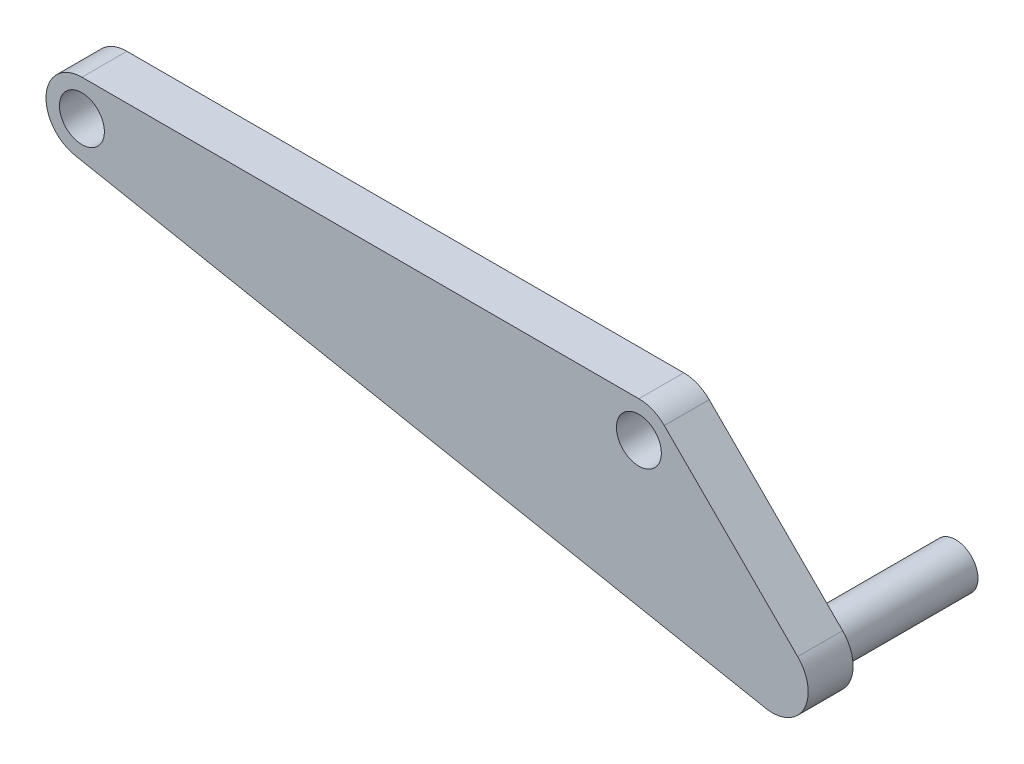
ISO-10303-21;
HEADER;
FILE_DESCRIPTION(('STEP AP214'),'2;1');
FILE_NAME('part.step','',(''),(''),'','','');
FILE_SCHEMA(('AUTOMOTIVE_DESIGN { 1 0 10303 214 1 1 1 1 }'));
ENDSEC;
DATA;
#1=APPLICATION_CONTEXT('core data for automotive mechanical design processes');
#2=APPLICATION_PROTOCOL_DEFINITION('international standard','automotive_design',2000,#1);
#3=PRODUCT_CONTEXT('',#1,'mechanical');
#4=PRODUCT('Part','Part','',(#3));
#5=PRODUCT_RELATED_PRODUCT_CATEGORY('part','',(#4));
#6=PRODUCT_DEFINITION_FORMATION('','',#4);
#7=PRODUCT_DEFINITION_CONTEXT('part definition',#1,'design');
#8=PRODUCT_DEFINITION('design','',#6,#7);
#9=PRODUCT_DEFINITION_SHAPE('','',#8);
#10=(LENGTH_UNIT() NAMED_UNIT(*) SI_UNIT(.MILLI.,.METRE.));
#11=(NAMED_UNIT(*) PLANE_ANGLE_UNIT() SI_UNIT($,.RADIAN.));
#12=(NAMED_UNIT(*) SI_UNIT($,.STERADIAN.) SOLID_ANGLE_UNIT());
#13=UNCERTAINTY_MEASURE_WITH_UNIT(LENGTH_MEASURE(1.E-05),#10,'distance_accuracy_value','');
#14=(GEOMETRIC_REPRESENTATION_CONTEXT(3) GLOBAL_UNCERTAINTY_ASSIGNED_CONTEXT((#13)) GLOBAL_UNIT_ASSIGNED_CONTEXT((#10,
#11,#12)) REPRESENTATION_CONTEXT('',''));
#15=CARTESIAN_POINT('',(0.,0.,0.));
#16=DIRECTION('',(0.,0.,1.));
#17=DIRECTION('',(1.,0.,0.));
#18=AXIS2_PLACEMENT_3D('',#15,#16,#17);
#19=CARTESIAN_POINT('',(-62.,0.,5.));
#20=DIRECTION('',(0.,0.,1.));
#21=DIRECTION('',(1.,0.,0.));
#22=AXIS2_PLACEMENT_3D('',#19,#20,#21);
#23=PLANE('',#22);
#24=CARTESIAN_POINT('',(-62.,0.,5.));
#25=DIRECTION('',(0.,0.,1.));
#26=DIRECTION('',(1.,0.,0.));
#27=AXIS2_PLACEMENT_3D('',#24,#25,#26);
#28=CIRCLE('',#27,2.5);
#29=CARTESIAN_POINT('',(-59.5,0.,5.));
#30=VERTEX_POINT('',#29);
#31=EDGE_CURVE('E124',#30,#30,#28,.T.);
#32=ORIENTED_EDGE('',*,*,#31,.F.);
#33=EDGE_LOOP('',(#32));
#34=FACE_BOUND('',#33,.T.);
#35=CARTESIAN_POINT('',(-62.,0.,5.));
#36=DIRECTION('',(0.,0.,1.));
#37=DIRECTION('',(1.,0.,0.));
#38=AXIS2_PLACEMENT_3D('',#35,#36,#37);
#39=CIRCLE('',#38,4.);
#40=CARTESIAN_POINT('',(-62.,3.99999999999999,5.));
#41=VERTEX_POINT('',#40);
#42=CARTESIAN_POINT('',(-62.7588657347675,-3.92735570028943,5.));
#43=VERTEX_POINT('',#42);
#44=EDGE_CURVE('E131',#41,#43,#39,.T.);
#45=ORIENTED_EDGE('',*,*,#44,.T.);
#46=DIRECTION('',(0.981838925072355,-0.189716433691869,0.));
#47=VECTOR('',#46,1.);
#48=CARTESIAN_POINT('',(14.0903766701501,-18.7765981052068,5.));
#49=LINE('',#48,#47);
#50=CARTESIAN_POINT('',(14.0903766701501,-18.7765981052068,5.));
#51=VERTEX_POINT('',#50);
#52=EDGE_CURVE('E89',#43,#51,#49,.T.);
#53=ORIENTED_EDGE('',*,*,#52,.T.);
#54=CARTESIAN_POINT('',(14.8492424049176,-14.8492424049174,5.));
#55=DIRECTION('',(0.,0.,1.));
#56=DIRECTION('',(1.,0.,0.));
#57=AXIS2_PLACEMENT_3D('',#54,#55,#56);
#58=CIRCLE('',#57,4.);
#59=CARTESIAN_POINT('',(17.6776695296638,-12.0208152801712,5.));
#60=VERTEX_POINT('',#59);
#61=EDGE_CURVE('E102',#51,#60,#58,.T.);
#62=ORIENTED_EDGE('',*,*,#61,.T.);
#63=DIRECTION('',(-0.707106781186551,0.707106781186544,0.));
#64=VECTOR('',#63,1.);
#65=CARTESIAN_POINT('',(2.82842712474617,2.82842712474621,5.));
#66=LINE('',#65,#64);
#67=CARTESIAN_POINT('',(2.82842712474617,2.82842712474621,5.));
#68=VERTEX_POINT('',#67);
#69=EDGE_CURVE('E96',#60,#68,#66,.T.);
#70=ORIENTED_EDGE('',*,*,#69,.T.);
#71=CARTESIAN_POINT('',(0.,0.,5.));
#72=DIRECTION('',(0.,0.,1.));
#73=DIRECTION('',(1.,0.,0.));
#74=AXIS2_PLACEMENT_3D('',#71,#72,#73);
#75=CIRCLE('',#74,4.);
#76=CARTESIAN_POINT('',(0.,4.,5.));
#77=VERTEX_POINT('',#76);
#78=EDGE_CURVE('E100',#68,#77,#75,.T.);
#79=ORIENTED_EDGE('',*,*,#78,.T.);
#80=DIRECTION('',(-1.,0.,0.));
#81=VECTOR('',#80,1.);
#82=CARTESIAN_POINT('',(-62.,3.99999999999999,5.));
#83=LINE('',#82,#81);
#84=EDGE_CURVE('E51',#77,#41,#83,.T.);
#85=ORIENTED_EDGE('',*,*,#84,.T.);
#86=EDGE_LOOP('',(#45,#53,#62,#70,#79,#85));
#87=FACE_BOUND('',#86,.T.);
#88=CARTESIAN_POINT('',(0.,0.,5.));
#89=DIRECTION('',(0.,0.,1.));
#90=DIRECTION('',(1.,0.,0.));
#91=AXIS2_PLACEMENT_3D('',#88,#89,#90);
#92=CIRCLE('',#91,2.5);
#93=CARTESIAN_POINT('',(2.5,0.,5.));
#94=VERTEX_POINT('',#93);
#95=EDGE_CURVE('E154',#94,#94,#92,.T.);
#96=ORIENTED_EDGE('',*,*,#95,.F.);
#97=EDGE_LOOP('',(#96));
#98=FACE_BOUND('',#97,.T.);
#99=ADVANCED_FACE('F34',(#34,#87,#98),#23,.T.);
#100=CARTESIAN_POINT('',(-62.,0.,0.));
#101=DIRECTION('',(0.,0.,1.));
#102=DIRECTION('',(1.,0.,0.));
#103=AXIS2_PLACEMENT_3D('',#100,#101,#102);
#104=PLANE('',#103);
#105=CARTESIAN_POINT('',(14.8492424049176,-14.8492424049174,0.));
#106=DIRECTION('',(0.,0.,1.));
#107=DIRECTION('',(1.,0.,0.));
#108=AXIS2_PLACEMENT_3D('',#105,#106,#107);
#109=CIRCLE('',#108,2.5);
#110=CARTESIAN_POINT('',(17.3492424049176,-14.8492424049174,0.));
#111=VERTEX_POINT('',#110);
#112=EDGE_CURVE('E11',#111,#111,#109,.F.);
#113=ORIENTED_EDGE('',*,*,#112,.F.);
#114=EDGE_LOOP('',(#113));
#115=FACE_BOUND('',#114,.T.);
#116=CARTESIAN_POINT('',(-62.,0.,0.));
#117=DIRECTION('',(0.,0.,1.));
#118=DIRECTION('',(1.,0.,0.));
#119=AXIS2_PLACEMENT_3D('',#116,#117,#118);
#120=CIRCLE('',#119,4.);
#121=CARTESIAN_POINT('',(-62.,3.99999999999999,0.));
#122=VERTEX_POINT('',#121);
#123=CARTESIAN_POINT('',(-62.7588657347675,-3.92735570028943,0.));
#124=VERTEX_POINT('',#123);
#125=EDGE_CURVE('E120',#122,#124,#120,.T.);
#126=ORIENTED_EDGE('',*,*,#125,.F.);
#127=DIRECTION('',(-1.,0.,0.));
#128=VECTOR('',#127,1.);
#129=CARTESIAN_POINT('',(-62.,3.99999999999999,0.));
#130=LINE('',#129,#128);
#131=CARTESIAN_POINT('',(0.,4.,0.));
#132=VERTEX_POINT('',#131);
#133=EDGE_CURVE('E80',#132,#122,#130,.T.);
#134=ORIENTED_EDGE('',*,*,#133,.F.);
#135=CARTESIAN_POINT('',(0.,0.,0.));
#136=DIRECTION('',(0.,0.,1.));
#137=DIRECTION('',(1.,0.,0.));
#138=AXIS2_PLACEMENT_3D('',#135,#136,#137);
#139=CIRCLE('',#138,4.);
#140=CARTESIAN_POINT('',(2.82842712474617,2.82842712474621,0.));
#141=VERTEX_POINT('',#140);
#142=EDGE_CURVE('E74',#141,#132,#139,.T.);
#143=ORIENTED_EDGE('',*,*,#142,.F.);
#144=DIRECTION('',(-0.707106781186551,0.707106781186544,0.));
#145=VECTOR('',#144,1.);
#146=CARTESIAN_POINT('',(2.82842712474617,2.82842712474621,0.));
#147=LINE('',#146,#145);
#148=CARTESIAN_POINT('',(17.6776695296638,-12.0208152801712,0.));
#149=VERTEX_POINT('',#148);
#150=EDGE_CURVE('E110',#149,#141,#147,.T.);
#151=ORIENTED_EDGE('',*,*,#150,.F.);
#152=CARTESIAN_POINT('',(14.8492424049176,-14.8492424049174,0.));
#153=DIRECTION('',(0.,0.,1.));
#154=DIRECTION('',(1.,0.,0.));
#155=AXIS2_PLACEMENT_3D('',#152,#153,#154);
#156=CIRCLE('',#155,4.);
#157=CARTESIAN_POINT('',(14.0903766701501,-18.7765981052068,0.));
#158=VERTEX_POINT('',#157);
#159=EDGE_CURVE('E126',#158,#149,#156,.T.);
#160=ORIENTED_EDGE('',*,*,#159,.F.);
#161=DIRECTION('',(0.981838925072355,-0.189716433691869,0.));
#162=VECTOR('',#161,1.);
#163=CARTESIAN_POINT('',(14.0903766701501,-18.7765981052068,0.));
#164=LINE('',#163,#162);
#165=EDGE_CURVE('E123',#124,#158,#164,.T.);
#166=ORIENTED_EDGE('',*,*,#165,.F.);
#167=EDGE_LOOP('',(#126,#134,#143,#151,#160,#166));
#168=FACE_BOUND('',#167,.T.);
#169=CARTESIAN_POINT('',(-62.,0.,0.));
#170=DIRECTION('',(0.,0.,1.));
#171=DIRECTION('',(1.,0.,0.));
#172=AXIS2_PLACEMENT_3D('',#169,#170,#171);
#173=CIRCLE('',#172,2.5);
#174=CARTESIAN_POINT('',(-59.5,0.,0.));
#175=VERTEX_POINT('',#174);
#176=EDGE_CURVE('E151',#175,#175,#173,.T.);
#177=ORIENTED_EDGE('',*,*,#176,.T.);
#178=EDGE_LOOP('',(#177));
#179=FACE_BOUND('',#178,.T.);
#180=CARTESIAN_POINT('',(0.,0.,0.));
#181=DIRECTION('',(0.,0.,1.));
#182=DIRECTION('',(1.,0.,0.));
#183=AXIS2_PLACEMENT_3D('',#180,#181,#182);
#184=CIRCLE('',#183,2.5);
#185=CARTESIAN_POINT('',(2.5,0.,0.));
#186=VERTEX_POINT('',#185);
#187=EDGE_CURVE('E157',#186,#186,#184,.T.);
#188=ORIENTED_EDGE('',*,*,#187,.T.);
#189=EDGE_LOOP('',(#188));
#190=FACE_BOUND('',#189,.T.);
#191=ADVANCED_FACE('F143',(#115,#168,#179,#190),#104,.F.);
#192=CARTESIAN_POINT('',(-62.,0.,5.));
#193=DIRECTION('',(0.,0.,-1.));
#194=DIRECTION('',(-1.,0.,0.));
#195=AXIS2_PLACEMENT_3D('',#192,#193,#194);
#196=CYLINDRICAL_SURFACE('',#195,4.);
#197=ORIENTED_EDGE('',*,*,#125,.T.);
#198=DIRECTION('',(0.,0.,-1.));
#199=VECTOR('',#198,1.);
#200=CARTESIAN_POINT('',(-62.7588657347675,-3.92735570028943,5.));
#201=LINE('',#200,#199);
#202=EDGE_CURVE('E43',#43,#124,#201,.T.);
#203=ORIENTED_EDGE('',*,*,#202,.F.);
#204=ORIENTED_EDGE('',*,*,#44,.F.);
#205=DIRECTION('',(0.,0.,-1.));
#206=VECTOR('',#205,1.);
#207=CARTESIAN_POINT('',(-62.,3.99999999999999,5.));
#208=LINE('',#207,#206);
#209=EDGE_CURVE('E116',#41,#122,#208,.T.);
#210=ORIENTED_EDGE('',*,*,#209,.T.);
#211=EDGE_LOOP('',(#197,#203,#204,#210));
#212=FACE_BOUND('',#211,.T.);
#213=ADVANCED_FACE('F36',(#212),#196,.T.);
#214=CARTESIAN_POINT('',(14.0903766701501,-18.7765981052068,5.));
#215=DIRECTION('',(0.189716433691869,0.981838925072355,0.));
#216=DIRECTION('',(-0.981838925072355,0.189716433691869,0.));
#217=AXIS2_PLACEMENT_3D('',#214,#215,#216);
#218=PLANE('',#217);
#219=ORIENTED_EDGE('',*,*,#165,.T.);
#220=DIRECTION('',(0.,0.,-1.));
#221=VECTOR('',#220,1.);
#222=CARTESIAN_POINT('',(14.0903766701501,-18.7765981052068,5.));
#223=LINE('',#222,#221);
#224=EDGE_CURVE('E135',#51,#158,#223,.T.);
#225=ORIENTED_EDGE('',*,*,#224,.F.);
#226=ORIENTED_EDGE('',*,*,#52,.F.);
#227=ORIENTED_EDGE('',*,*,#202,.T.);
#228=EDGE_LOOP('',(#219,#225,#226,#227));
#229=FACE_BOUND('',#228,.T.);
#230=ADVANCED_FACE('F138',(#229),#218,.F.);
#231=CARTESIAN_POINT('',(14.8492424049176,-14.8492424049174,5.));
#232=DIRECTION('',(0.,0.,-1.));
#233=DIRECTION('',(-1.,0.,0.));
#234=AXIS2_PLACEMENT_3D('',#231,#232,#233);
#235=CYLINDRICAL_SURFACE('',#234,4.);
#236=ORIENTED_EDGE('',*,*,#159,.T.);
#237=DIRECTION('',(0.,0.,-1.));
#238=VECTOR('',#237,1.);
#239=CARTESIAN_POINT('',(17.6776695296638,-12.0208152801712,5.));
#240=LINE('',#239,#238);
#241=EDGE_CURVE('E111',#60,#149,#240,.T.);
#242=ORIENTED_EDGE('',*,*,#241,.F.);
#243=ORIENTED_EDGE('',*,*,#61,.F.);
#244=ORIENTED_EDGE('',*,*,#224,.T.);
#245=EDGE_LOOP('',(#236,#242,#243,#244));
#246=FACE_BOUND('',#245,.T.);
#247=ADVANCED_FACE('F147',(#246),#235,.T.);
#248=CARTESIAN_POINT('',(2.82842712474617,2.82842712474621,5.));
#249=DIRECTION('',(-0.707106781186544,-0.707106781186551,0.));
#250=DIRECTION('',(0.707106781186551,-0.707106781186544,0.));
#251=AXIS2_PLACEMENT_3D('',#248,#249,#250);
#252=PLANE('',#251);
#253=ORIENTED_EDGE('',*,*,#150,.T.);
#254=DIRECTION('',(0.,0.,-1.));
#255=VECTOR('',#254,1.);
#256=CARTESIAN_POINT('',(2.82842712474617,2.82842712474621,5.));
#257=LINE('',#256,#255);
#258=EDGE_CURVE('E107',#68,#141,#257,.T.);
#259=ORIENTED_EDGE('',*,*,#258,.F.);
#260=ORIENTED_EDGE('',*,*,#69,.F.);
#261=ORIENTED_EDGE('',*,*,#241,.T.);
#262=EDGE_LOOP('',(#253,#259,#260,#261));
#263=FACE_BOUND('',#262,.T.);
#264=ADVANCED_FACE('F108',(#263),#252,.F.);
#265=CARTESIAN_POINT('',(0.,0.,5.));
#266=DIRECTION('',(0.,0.,-1.));
#267=DIRECTION('',(-1.,0.,0.));
#268=AXIS2_PLACEMENT_3D('',#265,#266,#267);
#269=CYLINDRICAL_SURFACE('',#268,4.);
#270=ORIENTED_EDGE('',*,*,#142,.T.);
#271=DIRECTION('',(0.,0.,-1.));
#272=VECTOR('',#271,1.);
#273=CARTESIAN_POINT('',(0.,4.,5.));
#274=LINE('',#273,#272);
#275=EDGE_CURVE('E112',#77,#132,#274,.T.);
#276=ORIENTED_EDGE('',*,*,#275,.F.);
#277=ORIENTED_EDGE('',*,*,#78,.F.);
#278=ORIENTED_EDGE('',*,*,#258,.T.);
#279=EDGE_LOOP('',(#270,#276,#277,#278));
#280=FACE_BOUND('',#279,.T.);
#281=ADVANCED_FACE('F114',(#280),#269,.T.);
#282=CARTESIAN_POINT('',(-62.,3.99999999999999,5.));
#283=DIRECTION('',(0.,-1.,0.));
#284=DIRECTION('',(1.,0.,0.));
#285=AXIS2_PLACEMENT_3D('',#282,#283,#284);
#286=PLANE('',#285);
#287=ORIENTED_EDGE('',*,*,#133,.T.);
#288=ORIENTED_EDGE('',*,*,#209,.F.);
#289=ORIENTED_EDGE('',*,*,#84,.F.);
#290=ORIENTED_EDGE('',*,*,#275,.T.);
#291=EDGE_LOOP('',(#287,#288,#289,#290));
#292=FACE_BOUND('',#291,.T.);
#293=ADVANCED_FACE('F203',(#292),#286,.F.);
#294=CARTESIAN_POINT('',(-62.,0.,5.));
#295=DIRECTION('',(0.,0.,-1.));
#296=DIRECTION('',(-1.,0.,0.));
#297=AXIS2_PLACEMENT_3D('',#294,#295,#296);
#298=CYLINDRICAL_SURFACE('',#297,2.5);
#299=ORIENTED_EDGE('',*,*,#31,.T.);
#300=EDGE_LOOP('',(#299));
#301=FACE_BOUND('',#300,.T.);
#302=ORIENTED_EDGE('',*,*,#176,.F.);
#303=EDGE_LOOP('',(#302));
#304=FACE_BOUND('',#303,.T.);
#305=ADVANCED_FACE('F187',(#301,#304),#298,.F.);
#306=CARTESIAN_POINT('',(0.,0.,5.));
#307=DIRECTION('',(0.,0.,-1.));
#308=DIRECTION('',(-1.,0.,0.));
#309=AXIS2_PLACEMENT_3D('',#306,#307,#308);
#310=CYLINDRICAL_SURFACE('',#309,2.5);
#311=ORIENTED_EDGE('',*,*,#95,.T.);
#312=EDGE_LOOP('',(#311));
#313=FACE_BOUND('',#312,.T.);
#314=ORIENTED_EDGE('',*,*,#187,.F.);
#315=EDGE_LOOP('',(#314));
#316=FACE_BOUND('',#315,.T.);
#317=ADVANCED_FACE('F178',(#313,#316),#310,.F.);
#318=CARTESIAN_POINT('',(14.8492424049176,-14.8492424049174,-15.4));
#319=DIRECTION('',(0.,0.,-1.));
#320=DIRECTION('',(-1.,0.,0.));
#321=AXIS2_PLACEMENT_3D('',#318,#319,#320);
#322=PLANE('',#321);
#323=CARTESIAN_POINT('',(14.8492424049176,-14.8492424049174,-15.4));
#324=DIRECTION('',(0.,0.,-1.));
#325=DIRECTION('',(-1.,0.,0.));
#326=AXIS2_PLACEMENT_3D('',#323,#324,#325);
#327=CIRCLE('',#326,2.5);
#328=CARTESIAN_POINT('',(17.3492424049176,-14.8492424049174,-15.4));
#329=VERTEX_POINT('',#328);
#330=EDGE_CURVE('E160',#329,#329,#327,.T.);
#331=ORIENTED_EDGE('',*,*,#330,.T.);
#332=EDGE_LOOP('',(#331));
#333=FACE_BOUND('',#332,.T.);
#334=CARTESIAN_POINT('',(14.8492424049176,-14.8492424049174,-15.4));
#335=DIRECTION('',(0.,0.,-1.));
#336=DIRECTION('',(-1.,0.,0.));
#337=AXIS2_PLACEMENT_3D('',#334,#335,#336);
#338=CIRCLE('',#337,0.500000000000001);
#339=CARTESIAN_POINT('',(14.3492424049176,-14.8492424049174,-15.4));
#340=VERTEX_POINT('',#339);
#341=EDGE_CURVE('E165',#340,#340,#338,.T.);
#342=ORIENTED_EDGE('',*,*,#341,.F.);
#343=EDGE_LOOP('',(#342));
#344=FACE_BOUND('',#343,.T.);
#345=ADVANCED_FACE('F175',(#333,#344),#322,.T.);
#346=CARTESIAN_POINT('',(14.8492424049176,-14.8492424049174,-15.4));
#347=DIRECTION('',(0.,0.,1.));
#348=DIRECTION('',(1.,0.,0.));
#349=AXIS2_PLACEMENT_3D('',#346,#347,#348);
#350=CYLINDRICAL_SURFACE('',#349,2.5);
#351=CARTESIAN_POINT('',(17.3492424049176,-14.8492424049174,-15.4));
#352=CARTESIAN_POINT('',(17.3492424049176,-14.8492424049174,-15.2395833333333));
#353=CARTESIAN_POINT('',(17.3492424049176,-14.8492424049174,-15.0791666666667));
#354=CARTESIAN_POINT('',(17.3492424049176,-14.8492424049174,-14.7583333333333));
#355=CARTESIAN_POINT('',(17.3492424049176,-14.8492424049174,-14.5979166666667));
#356=CARTESIAN_POINT('',(17.3492424049176,-14.8492424049174,-14.2770833333333));
#357=CARTESIAN_POINT('',(17.3492424049176,-14.8492424049174,-14.1166666666667));
#358=CARTESIAN_POINT('',(17.3492424049176,-14.8492424049174,-13.7958333333333));
#359=CARTESIAN_POINT('',(17.3492424049176,-14.8492424049174,-13.6354166666667));
#360=CARTESIAN_POINT('',(17.3492424049176,-14.8492424049174,-13.3145833333333));
#361=CARTESIAN_POINT('',(17.3492424049176,-14.8492424049174,-13.1541666666667));
#362=CARTESIAN_POINT('',(17.3492424049176,-14.8492424049174,-12.8333333333333));
#363=CARTESIAN_POINT('',(17.3492424049176,-14.8492424049174,-12.6729166666667));
#364=CARTESIAN_POINT('',(17.3492424049176,-14.8492424049174,-12.3520833333333));
#365=CARTESIAN_POINT('',(17.3492424049176,-14.8492424049174,-12.1916666666667));
#366=CARTESIAN_POINT('',(17.3492424049176,-14.8492424049174,-11.8708333333333));
#367=CARTESIAN_POINT('',(17.3492424049176,-14.8492424049174,-11.7104166666667));
#368=CARTESIAN_POINT('',(17.3492424049176,-14.8492424049174,-11.3895833333333));
#369=CARTESIAN_POINT('',(17.3492424049176,-14.8492424049174,-11.2291666666667));
#370=CARTESIAN_POINT('',(17.3492424049176,-14.8492424049174,-10.9083333333333));
#371=CARTESIAN_POINT('',(17.3492424049176,-14.8492424049174,-10.7479166666667));
#372=CARTESIAN_POINT('',(17.3492424049176,-14.8492424049174,-10.4270833333333));
#373=CARTESIAN_POINT('',(17.3492424049176,-14.8492424049174,-10.2666666666667));
#374=CARTESIAN_POINT('',(17.3492424049176,-14.8492424049174,-9.94583333333333));
#375=CARTESIAN_POINT('',(17.3492424049176,-14.8492424049174,-9.78541666666667));
#376=CARTESIAN_POINT('',(17.3492424049176,-14.8492424049174,-9.46458333333333));
#377=CARTESIAN_POINT('',(17.3492424049176,-14.8492424049174,-9.30416666666667));
#378=CARTESIAN_POINT('',(17.3492424049176,-14.8492424049174,-8.98333333333333));
#379=CARTESIAN_POINT('',(17.3492424049176,-14.8492424049174,-8.82291666666667));
#380=CARTESIAN_POINT('',(17.3492424049176,-14.8492424049174,-8.50208333333333));
#381=CARTESIAN_POINT('',(17.3492424049176,-14.8492424049174,-8.34166666666667));
#382=CARTESIAN_POINT('',(17.3492424049176,-14.8492424049174,-8.02083333333333));
#383=CARTESIAN_POINT('',(17.3492424049176,-14.8492424049174,-7.86041666666667));
#384=CARTESIAN_POINT('',(17.3492424049176,-14.8492424049174,-7.53958333333333));
#385=CARTESIAN_POINT('',(17.3492424049176,-14.8492424049174,-7.37916666666667));
#386=CARTESIAN_POINT('',(17.3492424049176,-14.8492424049174,-7.05833333333333));
#387=CARTESIAN_POINT('',(17.3492424049176,-14.8492424049174,-6.89791666666667));
#388=CARTESIAN_POINT('',(17.3492424049176,-14.8492424049174,-6.57708333333334));
#389=CARTESIAN_POINT('',(17.3492424049176,-14.8492424049174,-6.41666666666667));
#390=CARTESIAN_POINT('',(17.3492424049176,-14.8492424049174,-6.09583333333333));
#391=CARTESIAN_POINT('',(17.3492424049176,-14.8492424049174,-5.93541666666667));
#392=CARTESIAN_POINT('',(17.3492424049176,-14.8492424049174,-5.61458333333333));
#393=CARTESIAN_POINT('',(17.3492424049176,-14.8492424049174,-5.45416666666667));
#394=CARTESIAN_POINT('',(17.3492424049176,-14.8492424049174,-5.13333333333334));
#395=CARTESIAN_POINT('',(17.3492424049176,-14.8492424049174,-4.97291666666667));
#396=CARTESIAN_POINT('',(17.3492424049176,-14.8492424049174,-4.65208333333334));
#397=CARTESIAN_POINT('',(17.3492424049176,-14.8492424049174,-4.49166666666667));
#398=CARTESIAN_POINT('',(17.3492424049176,-14.8492424049174,-4.17083333333333));
#399=CARTESIAN_POINT('',(17.3492424049176,-14.8492424049174,-4.01041666666667));
#400=CARTESIAN_POINT('',(17.3492424049176,-14.8492424049174,-3.68958333333333));
#401=CARTESIAN_POINT('',(17.3492424049176,-14.8492424049174,-3.52916666666667));
#402=CARTESIAN_POINT('',(17.3492424049176,-14.8492424049174,-3.20833333333334));
#403=CARTESIAN_POINT('',(17.3492424049176,-14.8492424049174,-3.04791666666667));
#404=CARTESIAN_POINT('',(17.3492424049176,-14.8492424049174,-2.72708333333333));
#405=CARTESIAN_POINT('',(17.3492424049176,-14.8492424049174,-2.56666666666667));
#406=CARTESIAN_POINT('',(17.3492424049176,-14.8492424049174,-2.24583333333334));
#407=CARTESIAN_POINT('',(17.3492424049176,-14.8492424049174,-2.08541666666667));
#408=CARTESIAN_POINT('',(17.3492424049176,-14.8492424049174,-1.76458333333333));
#409=CARTESIAN_POINT('',(17.3492424049176,-14.8492424049174,-1.60416666666667));
#410=CARTESIAN_POINT('',(17.3492424049176,-14.8492424049174,-1.28333333333334));
#411=CARTESIAN_POINT('',(17.3492424049176,-14.8492424049174,-1.12291666666667));
#412=CARTESIAN_POINT('',(17.3492424049176,-14.8492424049174,-0.802083333333335));
#413=CARTESIAN_POINT('',(17.3492424049176,-14.8492424049174,-0.641666666666669));
#414=CARTESIAN_POINT('',(17.3492424049176,-14.8492424049174,-0.320833333333336));
#415=CARTESIAN_POINT('',(17.3492424049176,-14.8492424049174,-0.160416666666669));
#416=CARTESIAN_POINT('',(17.3492424049176,-14.8492424049174,0.));
#417=B_SPLINE_CURVE_WITH_KNOTS('',3,(#351,#352,#353,#354,#355,#356,#357,#358,#359,#360,#361,
#362,#363,#364,#365,#366,#367,#368,#369,#370,#371,#372,#373,#374,#375,#376,#377,#378,#379,#380,
#381,#382,#383,#384,#385,#386,#387,#388,#389,#390,#391,#392,#393,#394,#395,#396,#397,#398,#399,
#400,#401,#402,#403,#404,#405,#406,#407,#408,#409,#410,#411,#412,#413,#414,#415,#416),
.UNSPECIFIED.,.F.,.F.,(4,2,2,2,2,2,2,2,2,2,2,2,2,2,2,2,2,2,2,2,2,2,2,2,2,2,2,2,2,2,2,2,4),(0.,
0.481250000000001,0.962500000000002,1.44375,1.925,2.40625,2.8875,3.36875,3.85,4.33125,4.8125,
5.29375,5.775,6.25625,6.7375,7.21875,7.7,8.18125,8.6625,9.14375,9.625,10.10625,10.5875,11.06875,
11.55,12.03125,12.5125,12.99375,13.475,13.95625,14.4375,14.91875,15.4),.UNSPECIFIED.);
#418=EDGE_CURVE('BSEAM177',#329,#111,#417,.T.);
#419=ORIENTED_EDGE('',*,*,#330,.F.);
#420=ORIENTED_EDGE('',*,*,#112,.T.);
#421=ORIENTED_EDGE('',*,*,#418,.T.);
#422=ORIENTED_EDGE('',*,*,#418,.F.);
#423=EDGE_LOOP('',(#419,#421,#420,#422));
#424=FACE_BOUND('',#423,.T.);
#425=ADVANCED_FACE('F177',(#424),#350,.T.);
#426=CARTESIAN_POINT('',(14.8492424049176,-14.8492424049174,-15.4));
#427=DIRECTION('',(0.,0.,1.));
#428=DIRECTION('',(1.,0.,0.));
#429=AXIS2_PLACEMENT_3D('',#426,#427,#428);
#430=CYLINDRICAL_SURFACE('',#429,0.500000000000001);
#431=ORIENTED_EDGE('',*,*,#341,.T.);
#432=EDGE_LOOP('',(#431));
#433=FACE_BOUND('',#432,.T.);
#434=CARTESIAN_POINT('',(14.8492424049176,-14.8492424049174,0.));
#435=DIRECTION('',(0.,0.,-1.));
#436=DIRECTION('',(-1.,0.,0.));
#437=AXIS2_PLACEMENT_3D('',#434,#435,#436);
#438=CIRCLE('',#437,0.500000000000001);
#439=CARTESIAN_POINT('',(14.3492424049176,-14.8492424049174,0.));
#440=VERTEX_POINT('',#439);
#441=EDGE_CURVE('E166',#440,#440,#438,.T.);
#442=ORIENTED_EDGE('',*,*,#441,.F.);
#443=EDGE_LOOP('',(#442));
#444=FACE_BOUND('',#443,.T.);
#445=ADVANCED_FACE('F172',(#433,#444),#430,.F.);
#446=ORIENTED_EDGE('',*,*,#441,.T.);
#447=EDGE_LOOP('',(#446));
#448=FACE_BOUND('',#447,.T.);
#449=ADVANCED_FACE('F199',(#448),#104,.F.);
#450=CLOSED_SHELL('',(#99,#191,#213,#230,#247,#264,#281,#293,#305,#317,#345,#425,#445,#449));
#451=MANIFOLD_SOLID_BREP('B2',#450);
#452=ADVANCED_BREP_SHAPE_REPRESENTATION('',(#18,#451),#14);
#453=SHAPE_DEFINITION_REPRESENTATION(#9,#452);
ENDSEC;
END-ISO-10303-21;
